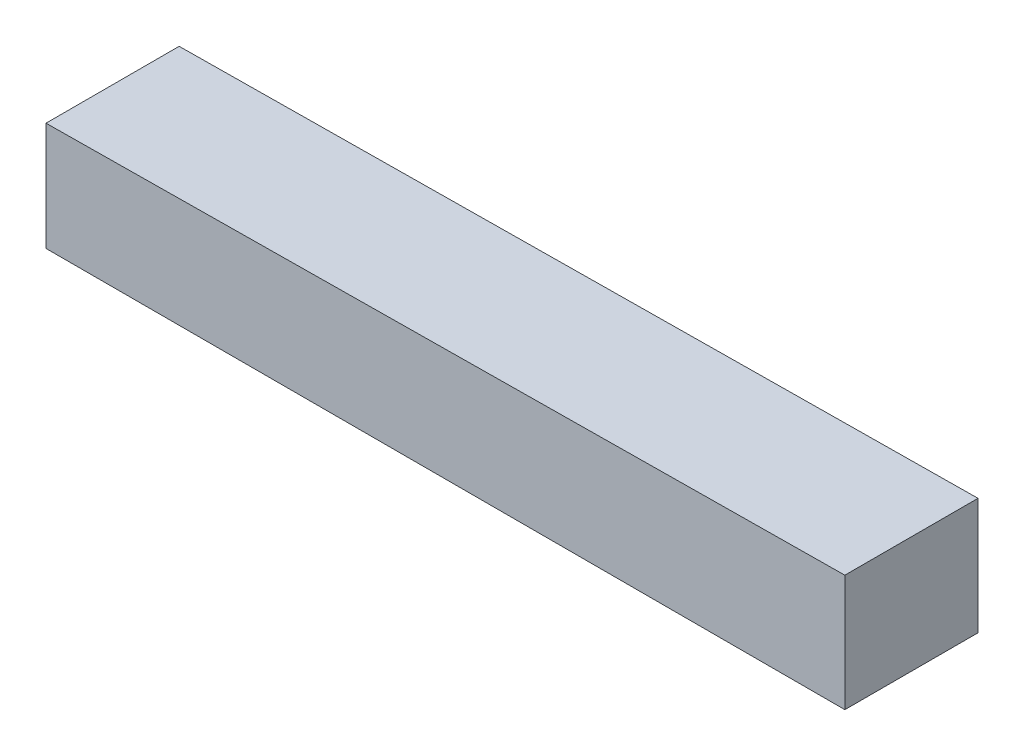
ISO-10303-21;
HEADER;
FILE_DESCRIPTION(('STEP AP214'),'2;1');
FILE_NAME('part.step','',(''),(''),'','','');
FILE_SCHEMA(('AUTOMOTIVE_DESIGN { 1 0 10303 214 1 1 1 1 }'));
ENDSEC;
DATA;
#1=APPLICATION_CONTEXT('core data for automotive mechanical design processes');
#2=APPLICATION_PROTOCOL_DEFINITION('international standard','automotive_design',2000,#1);
#3=PRODUCT_CONTEXT('',#1,'mechanical');
#4=PRODUCT('Part','Part','',(#3));
#5=PRODUCT_RELATED_PRODUCT_CATEGORY('part','',(#4));
#6=PRODUCT_DEFINITION_FORMATION('','',#4);
#7=PRODUCT_DEFINITION_CONTEXT('part definition',#1,'design');
#8=PRODUCT_DEFINITION('design','',#6,#7);
#9=PRODUCT_DEFINITION_SHAPE('','',#8);
#10=(LENGTH_UNIT() NAMED_UNIT(*) SI_UNIT(.MILLI.,.METRE.));
#11=(NAMED_UNIT(*) PLANE_ANGLE_UNIT() SI_UNIT($,.RADIAN.));
#12=(NAMED_UNIT(*) SI_UNIT($,.STERADIAN.) SOLID_ANGLE_UNIT());
#13=UNCERTAINTY_MEASURE_WITH_UNIT(LENGTH_MEASURE(1.E-05),#10,'distance_accuracy_value','');
#14=(GEOMETRIC_REPRESENTATION_CONTEXT(3) GLOBAL_UNCERTAINTY_ASSIGNED_CONTEXT((#13)) GLOBAL_UNIT_ASSIGNED_CONTEXT((#10,
#11,#12)) REPRESENTATION_CONTEXT('',''));
#15=CARTESIAN_POINT('',(0.,0.,0.));
#16=DIRECTION('',(0.,0.,1.));
#17=DIRECTION('',(1.,0.,0.));
#18=AXIS2_PLACEMENT_3D('',#15,#16,#17);
#19=CARTESIAN_POINT('',(478.257446151498,963.635501568345,24.));
#20=DIRECTION('',(0.,0.,-1.));
#21=DIRECTION('',(-1.,0.,0.));
#22=AXIS2_PLACEMENT_3D('',#19,#20,#21);
#23=PLANE('',#22);
#24=DIRECTION('',(0.,-1.,0.));
#25=VECTOR('',#24,1.);
#26=CARTESIAN_POINT('',(502.152262189073,967.254901583344,24.));
#27=LINE('',#26,#25);
#28=CARTESIAN_POINT('',(502.152262189073,967.254901583344,24.));
#29=VERTEX_POINT('',#28);
#30=CARTESIAN_POINT('',(502.152262189073,960.254901583344,24.));
#31=VERTEX_POINT('',#30);
#32=EDGE_CURVE('E52',#29,#31,#27,.T.);
#33=ORIENTED_EDGE('',*,*,#32,.F.);
#34=DIRECTION('',(0.999950003749687,0.00999950003749726,0.));
#35=VECTOR('',#34,1.);
#36=CARTESIAN_POINT('',(454.152262189073,966.774901583344,24.));
#37=LINE('',#36,#35);
#38=CARTESIAN_POINT('',(454.152262189073,966.774901583344,24.));
#39=VERTEX_POINT('',#38);
#40=EDGE_CURVE('E45',#39,#29,#37,.T.);
#41=ORIENTED_EDGE('',*,*,#40,.F.);
#42=DIRECTION('',(0.,1.,0.));
#43=VECTOR('',#42,1.);
#44=CARTESIAN_POINT('',(454.152262189073,960.254901583344,24.));
#45=LINE('',#44,#43);
#46=CARTESIAN_POINT('',(454.152262189073,960.254901583344,24.));
#47=VERTEX_POINT('',#46);
#48=EDGE_CURVE('E93',#47,#39,#45,.T.);
#49=ORIENTED_EDGE('',*,*,#48,.F.);
#50=DIRECTION('',(-1.,0.,0.));
#51=VECTOR('',#50,1.);
#52=CARTESIAN_POINT('',(502.152262189073,960.254901583344,24.));
#53=LINE('',#52,#51);
#54=EDGE_CURVE('E78',#31,#47,#53,.T.);
#55=ORIENTED_EDGE('',*,*,#54,.F.);
#56=EDGE_LOOP('',(#33,#41,#49,#55));
#57=FACE_BOUND('',#56,.T.);
#58=ADVANCED_FACE('F42',(#57),#23,.F.);
#59=CARTESIAN_POINT('',(478.257446151498,963.635501568345,16.));
#60=DIRECTION('',(0.,0.,-1.));
#61=DIRECTION('',(-1.,0.,0.));
#62=AXIS2_PLACEMENT_3D('',#59,#60,#61);
#63=PLANE('',#62);
#64=DIRECTION('',(0.,-1.,0.));
#65=VECTOR('',#64,1.);
#66=CARTESIAN_POINT('',(502.152262189073,967.254901583344,16.));
#67=LINE('',#66,#65);
#68=CARTESIAN_POINT('',(502.152262189073,967.254901583344,16.));
#69=VERTEX_POINT('',#68);
#70=CARTESIAN_POINT('',(502.152262189073,960.254901583344,16.));
#71=VERTEX_POINT('',#70);
#72=EDGE_CURVE('E11',#69,#71,#67,.T.);
#73=ORIENTED_EDGE('',*,*,#72,.T.);
#74=DIRECTION('',(-1.,0.,0.));
#75=VECTOR('',#74,1.);
#76=CARTESIAN_POINT('',(502.152262189073,960.254901583344,16.));
#77=LINE('',#76,#75);
#78=CARTESIAN_POINT('',(454.152262189073,960.254901583344,16.));
#79=VERTEX_POINT('',#78);
#80=EDGE_CURVE('E89',#71,#79,#77,.T.);
#81=ORIENTED_EDGE('',*,*,#80,.T.);
#82=DIRECTION('',(0.,1.,0.));
#83=VECTOR('',#82,1.);
#84=CARTESIAN_POINT('',(454.152262189073,960.254901583344,16.));
#85=LINE('',#84,#83);
#86=CARTESIAN_POINT('',(454.152262189073,966.774901583344,16.));
#87=VERTEX_POINT('',#86);
#88=EDGE_CURVE('E82',#79,#87,#85,.T.);
#89=ORIENTED_EDGE('',*,*,#88,.T.);
#90=DIRECTION('',(0.999950003749687,0.00999950003749726,0.));
#91=VECTOR('',#90,1.);
#92=CARTESIAN_POINT('',(454.152262189073,966.774901583344,16.));
#93=LINE('',#92,#91);
#94=EDGE_CURVE('E86',#87,#69,#93,.T.);
#95=ORIENTED_EDGE('',*,*,#94,.T.);
#96=EDGE_LOOP('',(#73,#81,#89,#95));
#97=FACE_BOUND('',#96,.T.);
#98=ADVANCED_FACE('F84',(#97),#63,.T.);
#99=CARTESIAN_POINT('',(502.152262189073,967.254901583344,24.));
#100=DIRECTION('',(1.,0.,0.));
#101=DIRECTION('',(0.,-1.,0.));
#102=AXIS2_PLACEMENT_3D('',#99,#100,#101);
#103=PLANE('',#102);
#104=ORIENTED_EDGE('',*,*,#32,.T.);
#105=DIRECTION('',(0.,0.,-1.));
#106=VECTOR('',#105,1.);
#107=CARTESIAN_POINT('',(502.152262189073,960.254901583344,24.));
#108=LINE('',#107,#106);
#109=EDGE_CURVE('E117',#31,#71,#108,.T.);
#110=ORIENTED_EDGE('',*,*,#109,.T.);
#111=ORIENTED_EDGE('',*,*,#72,.F.);
#112=DIRECTION('',(0.,0.,-1.));
#113=VECTOR('',#112,1.);
#114=CARTESIAN_POINT('',(502.152262189073,967.254901583344,24.));
#115=LINE('',#114,#113);
#116=EDGE_CURVE('E106',#29,#69,#115,.T.);
#117=ORIENTED_EDGE('',*,*,#116,.F.);
#118=EDGE_LOOP('',(#104,#110,#111,#117));
#119=FACE_BOUND('',#118,.T.);
#120=ADVANCED_FACE('F127',(#119),#103,.T.);
#121=CARTESIAN_POINT('',(502.152262189073,960.254901583344,24.));
#122=DIRECTION('',(0.,-1.,0.));
#123=DIRECTION('',(-1.,0.,0.));
#124=AXIS2_PLACEMENT_3D('',#121,#122,#123);
#125=PLANE('',#124);
#126=ORIENTED_EDGE('',*,*,#54,.T.);
#127=DIRECTION('',(0.,0.,-1.));
#128=VECTOR('',#127,1.);
#129=CARTESIAN_POINT('',(454.152262189073,960.254901583344,24.));
#130=LINE('',#129,#128);
#131=EDGE_CURVE('E92',#47,#79,#130,.T.);
#132=ORIENTED_EDGE('',*,*,#131,.T.);
#133=ORIENTED_EDGE('',*,*,#80,.F.);
#134=ORIENTED_EDGE('',*,*,#109,.F.);
#135=EDGE_LOOP('',(#126,#132,#133,#134));
#136=FACE_BOUND('',#135,.T.);
#137=ADVANCED_FACE('F129',(#136),#125,.T.);
#138=CARTESIAN_POINT('',(454.152262189073,960.254901583344,24.));
#139=DIRECTION('',(-1.,0.,0.));
#140=DIRECTION('',(0.,1.,0.));
#141=AXIS2_PLACEMENT_3D('',#138,#139,#140);
#142=PLANE('',#141);
#143=ORIENTED_EDGE('',*,*,#48,.T.);
#144=DIRECTION('',(0.,0.,-1.));
#145=VECTOR('',#144,1.);
#146=CARTESIAN_POINT('',(454.152262189073,966.774901583344,24.));
#147=LINE('',#146,#145);
#148=EDGE_CURVE('E96',#39,#87,#147,.T.);
#149=ORIENTED_EDGE('',*,*,#148,.T.);
#150=ORIENTED_EDGE('',*,*,#88,.F.);
#151=ORIENTED_EDGE('',*,*,#131,.F.);
#152=EDGE_LOOP('',(#143,#149,#150,#151));
#153=FACE_BOUND('',#152,.T.);
#154=ADVANCED_FACE('F97',(#153),#142,.T.);
#155=CARTESIAN_POINT('',(454.152262189073,966.774901583344,24.));
#156=DIRECTION('',(-0.00999950003749726,0.999950003749687,0.));
#157=DIRECTION('',(0.999950003749687,0.00999950003749726,0.));
#158=AXIS2_PLACEMENT_3D('',#155,#156,#157);
#159=PLANE('',#158);
#160=ORIENTED_EDGE('',*,*,#40,.T.);
#161=ORIENTED_EDGE('',*,*,#116,.T.);
#162=ORIENTED_EDGE('',*,*,#94,.F.);
#163=ORIENTED_EDGE('',*,*,#148,.F.);
#164=EDGE_LOOP('',(#160,#161,#162,#163));
#165=FACE_BOUND('',#164,.T.);
#166=ADVANCED_FACE('F104',(#165),#159,.T.);
#167=CLOSED_SHELL('',(#58,#98,#120,#137,#154,#166));
#168=MANIFOLD_SOLID_BREP('B2',#167);
#169=ADVANCED_BREP_SHAPE_REPRESENTATION('',(#18,#168),#14);
#170=SHAPE_DEFINITION_REPRESENTATION(#9,#169);
ENDSEC;
END-ISO-10303-21;
